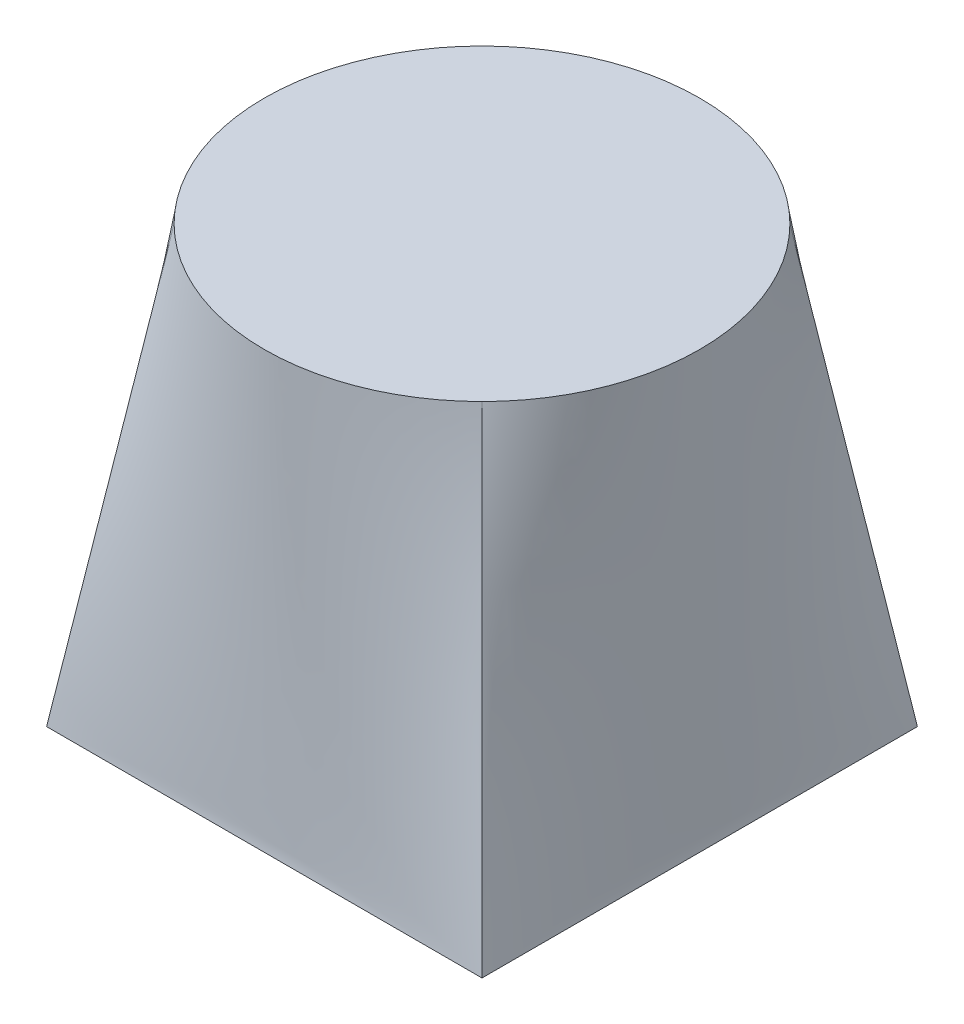
ISO-10303-21;
HEADER;
FILE_DESCRIPTION(('STEP AP214'),'2;1');
FILE_NAME('part.step','',(''),(''),'','','');
FILE_SCHEMA(('AUTOMOTIVE_DESIGN { 1 0 10303 214 1 1 1 1 }'));
ENDSEC;
DATA;
#1=APPLICATION_CONTEXT('core data for automotive mechanical design processes');
#2=APPLICATION_PROTOCOL_DEFINITION('international standard','automotive_design',2000,#1);
#3=PRODUCT_CONTEXT('',#1,'mechanical');
#4=PRODUCT('Part','Part','',(#3));
#5=PRODUCT_RELATED_PRODUCT_CATEGORY('part','',(#4));
#6=PRODUCT_DEFINITION_FORMATION('','',#4);
#7=PRODUCT_DEFINITION_CONTEXT('part definition',#1,'design');
#8=PRODUCT_DEFINITION('design','',#6,#7);
#9=PRODUCT_DEFINITION_SHAPE('','',#8);
#10=(LENGTH_UNIT() NAMED_UNIT(*) SI_UNIT(.MILLI.,.METRE.));
#11=(NAMED_UNIT(*) PLANE_ANGLE_UNIT() SI_UNIT($,.RADIAN.));
#12=(NAMED_UNIT(*) SI_UNIT($,.STERADIAN.) SOLID_ANGLE_UNIT());
#13=UNCERTAINTY_MEASURE_WITH_UNIT(LENGTH_MEASURE(1.E-05),#10,'distance_accuracy_value','');
#14=(GEOMETRIC_REPRESENTATION_CONTEXT(3) GLOBAL_UNCERTAINTY_ASSIGNED_CONTEXT((#13)) GLOBAL_UNIT_ASSIGNED_CONTEXT((#10,
#11,#12)) REPRESENTATION_CONTEXT('',''));
#15=CARTESIAN_POINT('',(0.,0.,0.));
#16=DIRECTION('',(0.,0.,1.));
#17=DIRECTION('',(1.,0.,0.));
#18=AXIS2_PLACEMENT_3D('',#15,#16,#17);
#19=CARTESIAN_POINT('',(0.,10.,0.));
#20=DIRECTION('',(0.,1.,0.));
#21=DIRECTION('',(0.,0.,1.));
#22=AXIS2_PLACEMENT_3D('',#19,#20,#21);
#23=PLANE('',#22);
#24=CARTESIAN_POINT('',(0.,10.,0.));
#25=DIRECTION('',(0.,1.,0.));
#26=DIRECTION('',(0.,0.,1.));
#27=AXIS2_PLACEMENT_3D('',#24,#25,#26);
#28=CIRCLE('',#27,5.);
#29=CARTESIAN_POINT('',(-3.53553390593274,10.,3.53553390593274));
#30=VERTEX_POINT('',#29);
#31=CARTESIAN_POINT('',(3.53553390593274,10.,3.53553390593274));
#32=VERTEX_POINT('',#31);
#33=EDGE_CURVE('E106',#30,#32,#28,.T.);
#34=ORIENTED_EDGE('',*,*,#33,.T.);
#35=CARTESIAN_POINT('',(3.53553390593274,10.,-3.53553390593274));
#36=VERTEX_POINT('',#35);
#37=EDGE_CURVE('E100',#32,#36,#28,.T.);
#38=ORIENTED_EDGE('',*,*,#37,.T.);
#39=CARTESIAN_POINT('',(-3.53553390593274,10.,-3.53553390593274));
#40=VERTEX_POINT('',#39);
#41=EDGE_CURVE('E138',#36,#40,#28,.T.);
#42=ORIENTED_EDGE('',*,*,#41,.T.);
#43=EDGE_CURVE('E194',#40,#30,#28,.T.);
#44=ORIENTED_EDGE('',*,*,#43,.T.);
#45=EDGE_LOOP('',(#34,#38,#42,#44));
#46=FACE_BOUND('',#45,.T.);
#47=ADVANCED_FACE('F65',(#46),#23,.T.);
#48=CARTESIAN_POINT('',(5.,0.,-5.));
#49=DIRECTION('',(0.,-1.,0.));
#50=DIRECTION('',(0.,0.,-1.));
#51=AXIS2_PLACEMENT_3D('',#48,#49,#50);
#52=PLANE('',#51);
#53=DIRECTION('',(0.,0.,-1.));
#54=VECTOR('',#53,1.);
#55=CARTESIAN_POINT('',(5.,0.,5.));
#56=LINE('',#55,#54);
#57=CARTESIAN_POINT('',(5.,0.,5.));
#58=VERTEX_POINT('',#57);
#59=CARTESIAN_POINT('',(5.,0.,-5.));
#60=VERTEX_POINT('',#59);
#61=EDGE_CURVE('E119',#58,#60,#56,.T.);
#62=ORIENTED_EDGE('',*,*,#61,.F.);
#63=DIRECTION('',(1.,0.,0.));
#64=VECTOR('',#63,1.);
#65=CARTESIAN_POINT('',(-5.,0.,5.));
#66=LINE('',#65,#64);
#67=CARTESIAN_POINT('',(-5.,0.,5.));
#68=VERTEX_POINT('',#67);
#69=EDGE_CURVE('E12',#68,#58,#66,.T.);
#70=ORIENTED_EDGE('',*,*,#69,.F.);
#71=DIRECTION('',(0.,0.,1.));
#72=VECTOR('',#71,1.);
#73=CARTESIAN_POINT('',(-5.,0.,5.));
#74=LINE('',#73,#72);
#75=CARTESIAN_POINT('',(-5.,0.,-5.));
#76=VERTEX_POINT('',#75);
#77=EDGE_CURVE('E76',#76,#68,#74,.T.);
#78=ORIENTED_EDGE('',*,*,#77,.F.);
#79=DIRECTION('',(-1.,0.,0.));
#80=VECTOR('',#79,1.);
#81=CARTESIAN_POINT('',(-5.,0.,-5.));
#82=LINE('',#81,#80);
#83=EDGE_CURVE('E116',#60,#76,#82,.T.);
#84=ORIENTED_EDGE('',*,*,#83,.F.);
#85=EDGE_LOOP('',(#62,#70,#78,#84));
#86=FACE_BOUND('',#85,.T.);
#87=ADVANCED_FACE('F118',(#86),#52,.T.);
#88=CARTESIAN_POINT('',(-5.,0.,-5.));
#89=CARTESIAN_POINT('',(-3.53553390593274,10.,-3.53553390593274));
#90=CARTESIAN_POINT('',(-5.,0.,-4.16666666666667));
#91=CARTESIAN_POINT('',(-3.9522005725994,10.,-3.11886723926607));
#92=CARTESIAN_POINT('',(-5.,0.,-3.33333333333334));
#93=CARTESIAN_POINT('',(-4.32579298105229,10.,-2.59339721214962));
#94=CARTESIAN_POINT('',(-5.,0.,-2.08333333333334));
#95=CARTESIAN_POINT('',(-4.72016759446828,10.,-1.68213150016822));
#96=CARTESIAN_POINT('',(-5.,0.,-1.66666666666667));
#97=CARTESIAN_POINT('',(-4.82392482457469,10.,-1.35881651527707));
#98=CARTESIAN_POINT('',(-5.,0.,-0.833333333333337));
#99=CARTESIAN_POINT('',(-4.96388446697993,10.,-0.690278229276499));
#100=CARTESIAN_POINT('',(-5.,0.,-0.416666666666671));
#101=CARTESIAN_POINT('',(-5.,10.,-0.345177968644247));
#102=CARTESIAN_POINT('',(-5.,0.,0.416666666666663));
#103=CARTESIAN_POINT('',(-5.,10.,0.345177968644245));
#104=CARTESIAN_POINT('',(-5.,0.,0.833333333333329));
#105=CARTESIAN_POINT('',(-4.96388446697993,10.,0.690278229276497));
#106=CARTESIAN_POINT('',(-5.,0.,1.66666666666666));
#107=CARTESIAN_POINT('',(-4.82392482457469,10.,1.35881651527707));
#108=CARTESIAN_POINT('',(-5.,0.,2.08333333333333));
#109=CARTESIAN_POINT('',(-4.72016759446828,10.,1.68213150016822));
#110=CARTESIAN_POINT('',(-5.,0.,3.33333333333333));
#111=CARTESIAN_POINT('',(-4.32579298105229,10.,2.59339721214962));
#112=CARTESIAN_POINT('',(-5.,0.,4.16666666666667));
#113=CARTESIAN_POINT('',(-3.9522005725994,10.,3.11886723926607));
#114=CARTESIAN_POINT('',(-5.,0.,5.));
#115=CARTESIAN_POINT('',(-3.53553390593274,10.,3.53553390593274));
#116=B_SPLINE_SURFACE_WITH_KNOTS('',3,1,((#88,#89),(#90,#91),(#92,#93),(#94,#95),(#96,#97),(#98,
#99),(#100,#101),(#102,#103),(#104,#105),(#106,#107),(#108,#109),(#110,#111),(#112,#113),(#114,
#115)),.UNSPECIFIED.,.F.,.F.,.F.,(4,2,2,2,2,2,4),(2,2),(0.,0.25,0.375,0.5,0.625,0.75,1.),(0.,
1.),.UNSPECIFIED.);
#117=DIRECTION('',(0.143403383851936,0.979219556074953,-0.143403383851937));
#118=VECTOR('',#117,1.);
#119=CARTESIAN_POINT('',(-4.26776695296637,5.,4.26776695296637));
#120=LINE('',#119,#118);
#121=EDGE_CURVE('E133',#68,#30,#120,.T.);
#122=DIRECTION('',(-0.143403383851937,-0.979219556074953,-0.143403383851936));
#123=VECTOR('',#122,1.);
#124=CARTESIAN_POINT('',(-4.26776695296637,5.,-4.26776695296637));
#125=LINE('',#124,#123);
#126=EDGE_CURVE('E141',#40,#76,#125,.T.);
#127=ORIENTED_EDGE('',*,*,#77,.T.);
#128=ORIENTED_EDGE('',*,*,#121,.T.);
#129=ORIENTED_EDGE('',*,*,#43,.F.);
#130=ORIENTED_EDGE('',*,*,#126,.T.);
#131=EDGE_LOOP('',(#127,#128,#129,#130));
#132=FACE_BOUND('',#131,.T.);
#133=ADVANCED_FACE('F215',(#132),#116,.T.);
#134=CARTESIAN_POINT('',(-5.,0.,5.));
#135=CARTESIAN_POINT('',(-3.53553390593274,10.,3.53553390593274));
#136=CARTESIAN_POINT('',(-4.16666666666667,0.,5.));
#137=CARTESIAN_POINT('',(-3.11886723926607,10.,3.9522005725994));
#138=CARTESIAN_POINT('',(-3.33333333333334,0.,5.));
#139=CARTESIAN_POINT('',(-2.59339721214962,10.,4.32579298105229));
#140=CARTESIAN_POINT('',(-2.08333333333334,0.,5.));
#141=CARTESIAN_POINT('',(-1.68213150016822,10.,4.72016759446828));
#142=CARTESIAN_POINT('',(-1.66666666666667,0.,5.));
#143=CARTESIAN_POINT('',(-1.35881651527707,10.,4.82392482457469));
#144=CARTESIAN_POINT('',(-0.833333333333338,0.,5.));
#145=CARTESIAN_POINT('',(-0.690278229276499,10.,4.96388446697993));
#146=CARTESIAN_POINT('',(-0.416666666666671,0.,5.));
#147=CARTESIAN_POINT('',(-0.345177968644247,10.,5.));
#148=CARTESIAN_POINT('',(0.416666666666662,0.,5.));
#149=CARTESIAN_POINT('',(0.345177968644245,10.,5.));
#150=CARTESIAN_POINT('',(0.833333333333329,0.,5.));
#151=CARTESIAN_POINT('',(0.690278229276497,10.,4.96388446697993));
#152=CARTESIAN_POINT('',(1.66666666666666,0.,5.));
#153=CARTESIAN_POINT('',(1.35881651527707,10.,4.82392482457469));
#154=CARTESIAN_POINT('',(2.08333333333333,0.,5.));
#155=CARTESIAN_POINT('',(1.68213150016822,10.,4.72016759446828));
#156=CARTESIAN_POINT('',(3.33333333333333,0.,5.));
#157=CARTESIAN_POINT('',(2.59339721214962,10.,4.32579298105229));
#158=CARTESIAN_POINT('',(4.16666666666667,0.,5.));
#159=CARTESIAN_POINT('',(3.11886723926607,10.,3.9522005725994));
#160=CARTESIAN_POINT('',(5.,0.,5.));
#161=CARTESIAN_POINT('',(3.53553390593274,10.,3.53553390593274));
#162=B_SPLINE_SURFACE_WITH_KNOTS('',3,1,((#134,#135),(#136,#137),(#138,#139),(#140,#141),(#142,
#143),(#144,#145),(#146,#147),(#148,#149),(#150,#151),(#152,#153),(#154,#155),(#156,#157),(#158,
#159),(#160,#161)),.UNSPECIFIED.,.F.,.F.,.F.,(4,2,2,2,2,2,4),(2,2),(0.,0.25,0.375,0.5,0.625,
0.75,1.),(0.,1.),.UNSPECIFIED.);
#163=DIRECTION('',(-0.143403383851936,0.979219556074953,-0.143403383851937));
#164=VECTOR('',#163,1.);
#165=CARTESIAN_POINT('',(4.26776695296637,5.,4.26776695296637));
#166=LINE('',#165,#164);
#167=EDGE_CURVE('E85',#58,#32,#166,.T.);
#168=ORIENTED_EDGE('',*,*,#69,.T.);
#169=ORIENTED_EDGE('',*,*,#167,.T.);
#170=ORIENTED_EDGE('',*,*,#33,.F.);
#171=ORIENTED_EDGE('',*,*,#121,.F.);
#172=EDGE_LOOP('',(#168,#169,#170,#171));
#173=FACE_BOUND('',#172,.T.);
#174=ADVANCED_FACE('F164',(#173),#162,.T.);
#175=CARTESIAN_POINT('',(5.,0.,-5.));
#176=CARTESIAN_POINT('',(3.53553390593274,10.,-3.53553390593274));
#177=CARTESIAN_POINT('',(4.16666666666667,0.,-5.));
#178=CARTESIAN_POINT('',(3.11886723926607,10.,-3.9522005725994));
#179=CARTESIAN_POINT('',(3.33333333333334,0.,-5.));
#180=CARTESIAN_POINT('',(2.59339721214962,10.,-4.32579298105229));
#181=CARTESIAN_POINT('',(2.08333333333334,0.,-5.));
#182=CARTESIAN_POINT('',(1.68213150016822,10.,-4.72016759446828));
#183=CARTESIAN_POINT('',(1.66666666666667,0.,-5.));
#184=CARTESIAN_POINT('',(1.35881651527707,10.,-4.82392482457469));
#185=CARTESIAN_POINT('',(0.833333333333339,0.,-5.));
#186=CARTESIAN_POINT('',(0.690278229276499,10.,-4.96388446697993));
#187=CARTESIAN_POINT('',(0.416666666666671,0.,-5.));
#188=CARTESIAN_POINT('',(0.345177968644246,10.,-5.));
#189=CARTESIAN_POINT('',(-0.416666666666662,0.,-5.));
#190=CARTESIAN_POINT('',(-0.345177968644245,10.,-5.));
#191=CARTESIAN_POINT('',(-0.833333333333328,0.,-5.));
#192=CARTESIAN_POINT('',(-0.690278229276498,10.,-4.96388446697993));
#193=CARTESIAN_POINT('',(-1.66666666666666,0.,-5.));
#194=CARTESIAN_POINT('',(-1.35881651527707,9.99999999999999,-4.82392482457469));
#195=CARTESIAN_POINT('',(-2.08333333333333,0.,-5.));
#196=CARTESIAN_POINT('',(-1.68213150016822,10.,-4.72016759446828));
#197=CARTESIAN_POINT('',(-3.33333333333333,0.,-5.));
#198=CARTESIAN_POINT('',(-2.59339721214962,10.,-4.32579298105229));
#199=CARTESIAN_POINT('',(-4.16666666666666,0.,-5.));
#200=CARTESIAN_POINT('',(-3.11886723926607,10.,-3.95220057259941));
#201=CARTESIAN_POINT('',(-5.,0.,-5.));
#202=CARTESIAN_POINT('',(-3.53553390593274,10.,-3.53553390593274));
#203=B_SPLINE_SURFACE_WITH_KNOTS('',3,1,((#175,#176),(#177,#178),(#179,#180),(#181,#182),(#183,
#184),(#185,#186),(#187,#188),(#189,#190),(#191,#192),(#193,#194),(#195,#196),(#197,#198),(#199,
#200),(#201,#202)),.UNSPECIFIED.,.F.,.F.,.F.,(4,2,2,2,2,2,4),(2,2),(0.,0.25,0.375,0.5,0.625,
0.75,1.),(0.,1.),.UNSPECIFIED.);
#204=DIRECTION('',(-0.143403383851936,0.979219556074953,0.143403383851937));
#205=VECTOR('',#204,1.);
#206=CARTESIAN_POINT('',(4.26776695296637,5.,-4.26776695296637));
#207=LINE('',#206,#205);
#208=EDGE_CURVE('E132',#60,#36,#207,.T.);
#209=ORIENTED_EDGE('',*,*,#83,.T.);
#210=ORIENTED_EDGE('',*,*,#126,.F.);
#211=ORIENTED_EDGE('',*,*,#41,.F.);
#212=ORIENTED_EDGE('',*,*,#208,.F.);
#213=EDGE_LOOP('',(#209,#210,#211,#212));
#214=FACE_BOUND('',#213,.T.);
#215=ADVANCED_FACE('F137',(#214),#203,.T.);
#216=CARTESIAN_POINT('',(5.,0.,5.));
#217=CARTESIAN_POINT('',(3.53553390593274,10.,3.53553390593274));
#218=CARTESIAN_POINT('',(5.,0.,4.16666666666667));
#219=CARTESIAN_POINT('',(3.9522005725994,10.,3.11886723926607));
#220=CARTESIAN_POINT('',(5.,0.,3.33333333333334));
#221=CARTESIAN_POINT('',(4.32579298105229,10.,2.59339721214962));
#222=CARTESIAN_POINT('',(5.,0.,2.08333333333334));
#223=CARTESIAN_POINT('',(4.72016759446828,10.,1.68213150016822));
#224=CARTESIAN_POINT('',(5.,0.,1.66666666666667));
#225=CARTESIAN_POINT('',(4.82392482457469,10.,1.35881651527707));
#226=CARTESIAN_POINT('',(5.,0.,0.833333333333338));
#227=CARTESIAN_POINT('',(4.96388446697993,10.,0.690278229276499));
#228=CARTESIAN_POINT('',(5.,0.,0.416666666666671));
#229=CARTESIAN_POINT('',(5.,10.,0.345177968644247));
#230=CARTESIAN_POINT('',(5.,0.,-0.416666666666662));
#231=CARTESIAN_POINT('',(5.,10.,-0.345177968644245));
#232=CARTESIAN_POINT('',(5.,0.,-0.833333333333329));
#233=CARTESIAN_POINT('',(4.96388446697993,10.,-0.690278229276498));
#234=CARTESIAN_POINT('',(5.,0.,-1.66666666666666));
#235=CARTESIAN_POINT('',(4.82392482457469,9.99999999999999,-1.35881651527707));
#236=CARTESIAN_POINT('',(5.,0.,-2.08333333333333));
#237=CARTESIAN_POINT('',(4.72016759446828,10.,-1.68213150016822));
#238=CARTESIAN_POINT('',(5.,0.,-3.33333333333333));
#239=CARTESIAN_POINT('',(4.32579298105229,10.,-2.59339721214962));
#240=CARTESIAN_POINT('',(5.,0.,-4.16666666666667));
#241=CARTESIAN_POINT('',(3.95220057259941,10.,-3.11886723926607));
#242=CARTESIAN_POINT('',(5.,0.,-5.));
#243=CARTESIAN_POINT('',(3.53553390593274,10.,-3.53553390593274));
#244=B_SPLINE_SURFACE_WITH_KNOTS('',3,1,((#216,#217),(#218,#219),(#220,#221),(#222,#223),(#224,
#225),(#226,#227),(#228,#229),(#230,#231),(#232,#233),(#234,#235),(#236,#237),(#238,#239),(#240,
#241),(#242,#243)),.UNSPECIFIED.,.F.,.F.,.F.,(4,2,2,2,2,2,4),(2,2),(0.,0.25,0.375,0.5,0.625,
0.75,1.),(0.,1.),.UNSPECIFIED.);
#245=ORIENTED_EDGE('',*,*,#61,.T.);
#246=ORIENTED_EDGE('',*,*,#208,.T.);
#247=ORIENTED_EDGE('',*,*,#37,.F.);
#248=ORIENTED_EDGE('',*,*,#167,.F.);
#249=EDGE_LOOP('',(#245,#246,#247,#248));
#250=FACE_BOUND('',#249,.T.);
#251=ADVANCED_FACE('F131',(#250),#244,.T.);
#252=CLOSED_SHELL('',(#47,#87,#133,#174,#215,#251));
#253=MANIFOLD_SOLID_BREP('B2',#252);
#254=ADVANCED_BREP_SHAPE_REPRESENTATION('',(#18,#253),#14);
#255=SHAPE_DEFINITION_REPRESENTATION(#9,#254);
ENDSEC;
END-ISO-10303-21;
